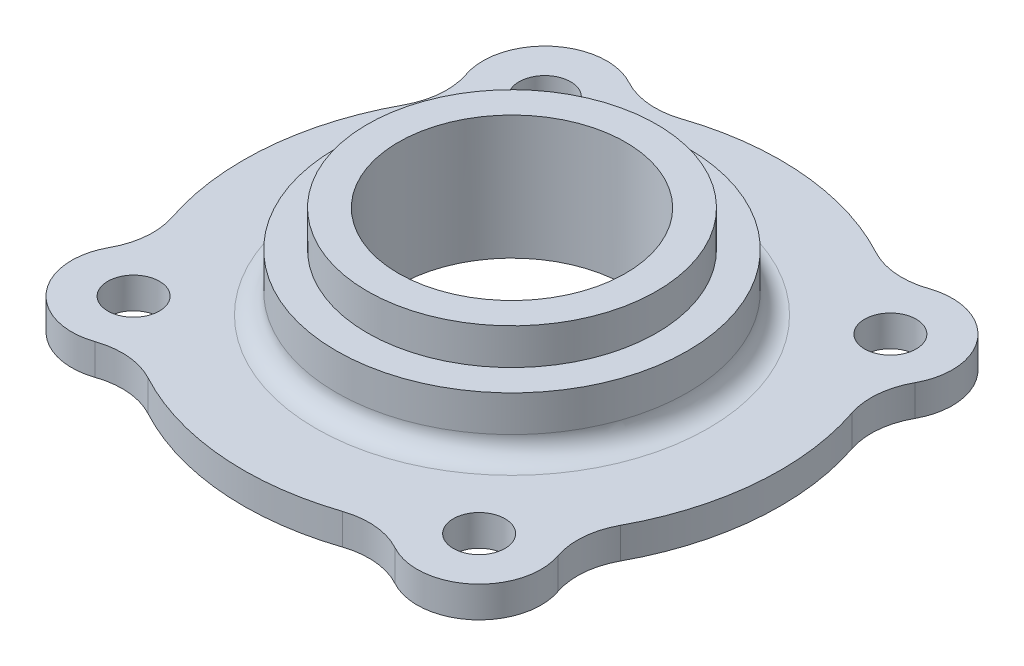
ISO-10303-21;
HEADER;
FILE_DESCRIPTION(('STEP AP214'),'2;1');
FILE_NAME('part.step','',(''),(''),'','','');
FILE_SCHEMA(('AUTOMOTIVE_DESIGN { 1 0 10303 214 1 1 1 1 }'));
ENDSEC;
DATA;
#1=APPLICATION_CONTEXT('core data for automotive mechanical design processes');
#2=APPLICATION_PROTOCOL_DEFINITION('international standard','automotive_design',2000,#1);
#3=PRODUCT_CONTEXT('',#1,'mechanical');
#4=PRODUCT('Part','Part','',(#3));
#5=PRODUCT_RELATED_PRODUCT_CATEGORY('part','',(#4));
#6=PRODUCT_DEFINITION_FORMATION('','',#4);
#7=PRODUCT_DEFINITION_CONTEXT('part definition',#1,'design');
#8=PRODUCT_DEFINITION('design','',#6,#7);
#9=PRODUCT_DEFINITION_SHAPE('','',#8);
#10=(LENGTH_UNIT() NAMED_UNIT(*) SI_UNIT(.MILLI.,.METRE.));
#11=(NAMED_UNIT(*) PLANE_ANGLE_UNIT() SI_UNIT($,.RADIAN.));
#12=(NAMED_UNIT(*) SI_UNIT($,.STERADIAN.) SOLID_ANGLE_UNIT());
#13=UNCERTAINTY_MEASURE_WITH_UNIT(LENGTH_MEASURE(1.E-05),#10,'distance_accuracy_value','');
#14=(GEOMETRIC_REPRESENTATION_CONTEXT(3) GLOBAL_UNCERTAINTY_ASSIGNED_CONTEXT((#13)) GLOBAL_UNIT_ASSIGNED_CONTEXT((#10,
#11,#12)) REPRESENTATION_CONTEXT('',''));
#15=CARTESIAN_POINT('',(0.,0.,0.));
#16=DIRECTION('',(0.,0.,1.));
#17=DIRECTION('',(1.,0.,0.));
#18=AXIS2_PLACEMENT_3D('',#15,#16,#17);
#19=CARTESIAN_POINT('',(0.,2.,0.));
#20=DIRECTION('',(0.,-1.,0.));
#21=DIRECTION('',(0.,0.,-1.));
#22=AXIS2_PLACEMENT_3D('',#19,#20,#21);
#23=TOROIDAL_SURFACE('',#22,19.,2.);
#24=CARTESIAN_POINT('',(0.,0.,0.));
#25=DIRECTION('',(0.,-1.,0.));
#26=DIRECTION('',(0.,0.,-1.));
#27=AXIS2_PLACEMENT_3D('',#24,#25,#26);
#28=CIRCLE('',#27,19.);
#29=CARTESIAN_POINT('',(0.,0.,-19.));
#30=VERTEX_POINT('',#29);
#31=EDGE_CURVE('E48',#30,#30,#28,.T.);
#32=ORIENTED_EDGE('',*,*,#31,.F.);
#33=EDGE_LOOP('',(#32));
#34=FACE_BOUND('',#33,.T.);
#35=CARTESIAN_POINT('',(0.,2.,0.));
#36=DIRECTION('',(0.,-1.,0.));
#37=DIRECTION('',(0.,0.,-1.));
#38=AXIS2_PLACEMENT_3D('',#35,#36,#37);
#39=CIRCLE('',#38,17.);
#40=CARTESIAN_POINT('',(0.,2.,-17.));
#41=VERTEX_POINT('',#40);
#42=EDGE_CURVE('E11',#41,#41,#39,.F.);
#43=ORIENTED_EDGE('',*,*,#42,.F.);
#44=EDGE_LOOP('',(#43));
#45=FACE_BOUND('',#44,.T.);
#46=ADVANCED_FACE('F39',(#34,#45),#23,.F.);
#47=CARTESIAN_POINT('',(-15.6989663666132,-3.,29.0265818693822));
#48=DIRECTION('',(0.,1.,0.));
#49=DIRECTION('',(0.,0.,1.));
#50=AXIS2_PLACEMENT_3D('',#47,#48,#49);
#51=CYLINDRICAL_SURFACE('',#50,7.);
#52=CARTESIAN_POINT('',(-15.6989663666132,0.,29.0265818693822));
#53=DIRECTION('',(0.,-1.,0.));
#54=DIRECTION('',(0.,0.,-1.));
#55=AXIS2_PLACEMENT_3D('',#52,#53,#54);
#56=CIRCLE('',#55,7.);
#57=CARTESIAN_POINT('',(-17.9641598120173,0.,22.4032217965115));
#58=VERTEX_POINT('',#57);
#59=CARTESIAN_POINT('',(-12.3688825918771,0.,22.8694281395133));
#60=VERTEX_POINT('',#59);
#61=EDGE_CURVE('E192',#58,#60,#56,.T.);
#62=ORIENTED_EDGE('',*,*,#61,.F.);
#63=DIRECTION('',(0.,1.,0.));
#64=VECTOR('',#63,1.);
#65=CARTESIAN_POINT('',(-17.9641598120173,-3.,22.4032217965115));
#66=LINE('',#65,#64);
#67=CARTESIAN_POINT('',(-17.9641598120173,-3.,22.4032217965115));
#68=VERTEX_POINT('',#67);
#69=EDGE_CURVE('E56',#68,#58,#66,.T.);
#70=ORIENTED_EDGE('',*,*,#69,.F.);
#71=CARTESIAN_POINT('',(-15.6989663666132,-3.,29.0265818693822));
#72=DIRECTION('',(0.,-1.,0.));
#73=DIRECTION('',(0.,0.,-1.));
#74=AXIS2_PLACEMENT_3D('',#71,#72,#73);
#75=CIRCLE('',#74,7.);
#76=CARTESIAN_POINT('',(-12.3688825918771,-3.,22.8694281395133));
#77=VERTEX_POINT('',#76);
#78=EDGE_CURVE('E254',#68,#77,#75,.T.);
#79=ORIENTED_EDGE('',*,*,#78,.T.);
#80=DIRECTION('',(0.,1.,0.));
#81=VECTOR('',#80,1.);
#82=CARTESIAN_POINT('',(-12.3688825918771,-3.,22.8694281395133));
#83=LINE('',#82,#81);
#84=EDGE_CURVE('E121',#77,#60,#83,.T.);
#85=ORIENTED_EDGE('',*,*,#84,.T.);
#86=EDGE_LOOP('',(#62,#70,#79,#85));
#87=FACE_BOUND('',#86,.T.);
#88=ADVANCED_FACE('F400',(#87),#51,.F.);
#89=CARTESIAN_POINT('',(-19.9057541937923,-3.,16.7260560197651));
#90=DIRECTION('',(0.,1.,0.));
#91=DIRECTION('',(0.,0.,1.));
#92=AXIS2_PLACEMENT_3D('',#89,#90,#91);
#93=CYLINDRICAL_SURFACE('',#92,6.);
#94=CARTESIAN_POINT('',(-19.9057541937923,0.,16.7260560197651));
#95=DIRECTION('',(0.,1.,0.));
#96=DIRECTION('',(0.,0.,1.));
#97=AXIS2_PLACEMENT_3D('',#94,#95,#96);
#98=CIRCLE('',#97,6.);
#99=CARTESIAN_POINT('',(-25.1634642036637,0.,13.8352973905991));
#100=VERTEX_POINT('',#99);
#101=EDGE_CURVE('E250',#100,#58,#98,.T.);
#102=ORIENTED_EDGE('',*,*,#101,.F.);
#103=DIRECTION('',(0.,1.,0.));
#104=VECTOR('',#103,1.);
#105=CARTESIAN_POINT('',(-25.1634642036637,-3.,13.8352973905991));
#106=LINE('',#105,#104);
#107=CARTESIAN_POINT('',(-25.1634642036637,-3.,13.8352973905991));
#108=VERTEX_POINT('',#107);
#109=EDGE_CURVE('E109',#108,#100,#106,.T.);
#110=ORIENTED_EDGE('',*,*,#109,.F.);
#111=CARTESIAN_POINT('',(-19.9057541937923,-3.,16.7260560197651));
#112=DIRECTION('',(0.,1.,0.));
#113=DIRECTION('',(0.,0.,1.));
#114=AXIS2_PLACEMENT_3D('',#111,#112,#113);
#115=CIRCLE('',#114,6.);
#116=EDGE_CURVE('E178',#108,#68,#115,.T.);
#117=ORIENTED_EDGE('',*,*,#116,.T.);
#118=ORIENTED_EDGE('',*,*,#69,.T.);
#119=EDGE_LOOP('',(#102,#110,#117,#118));
#120=FACE_BOUND('',#119,.T.);
#121=ADVANCED_FACE('F401',(#120),#93,.T.);
#122=CARTESIAN_POINT('',(-31.2974592151804,-3.,10.4627456565722));
#123=DIRECTION('',(0.,1.,0.));
#124=DIRECTION('',(0.,0.,1.));
#125=AXIS2_PLACEMENT_3D('',#122,#123,#124);
#126=CYLINDRICAL_SURFACE('',#125,7.);
#127=CARTESIAN_POINT('',(-31.2974592151804,0.,10.4627456565722));
#128=DIRECTION('',(0.,-1.,0.));
#129=DIRECTION('',(0.,0.,-1.));
#130=AXIS2_PLACEMENT_3D('',#127,#128,#129);
#131=CIRCLE('',#130,7.);
#132=CARTESIAN_POINT('',(-24.6586042301421,0.,8.24337536578413));
#133=VERTEX_POINT('',#132);
#134=EDGE_CURVE('E164',#133,#100,#131,.T.);
#135=ORIENTED_EDGE('',*,*,#134,.F.);
#136=DIRECTION('',(0.,1.,0.));
#137=VECTOR('',#136,1.);
#138=CARTESIAN_POINT('',(-24.6586042301421,-3.,8.24337536578413));
#139=LINE('',#138,#137);
#140=CARTESIAN_POINT('',(-24.6586042301421,-3.,8.24337536578413));
#141=VERTEX_POINT('',#140);
#142=EDGE_CURVE('E159',#141,#133,#139,.T.);
#143=ORIENTED_EDGE('',*,*,#142,.F.);
#144=CARTESIAN_POINT('',(-31.2974592151804,-3.,10.4627456565722));
#145=DIRECTION('',(0.,-1.,0.));
#146=DIRECTION('',(0.,0.,-1.));
#147=AXIS2_PLACEMENT_3D('',#144,#145,#146);
#148=CIRCLE('',#147,7.);
#149=EDGE_CURVE('E162',#141,#108,#148,.T.);
#150=ORIENTED_EDGE('',*,*,#149,.T.);
#151=ORIENTED_EDGE('',*,*,#109,.T.);
#152=EDGE_LOOP('',(#135,#143,#150,#151));
#153=FACE_BOUND('',#152,.T.);
#154=ADVANCED_FACE('F161',(#153),#126,.F.);
#155=CARTESIAN_POINT('',(0.,-3.,0.));
#156=DIRECTION('',(0.,1.,0.));
#157=DIRECTION('',(0.,0.,1.));
#158=AXIS2_PLACEMENT_3D('',#155,#156,#157);
#159=CYLINDRICAL_SURFACE('',#158,26.);
#160=CARTESIAN_POINT('',(0.,0.,0.));
#161=DIRECTION('',(0.,1.,0.));
#162=DIRECTION('',(0.,0.,1.));
#163=AXIS2_PLACEMENT_3D('',#160,#161,#162);
#164=CIRCLE('',#163,26.);
#165=CARTESIAN_POINT('',(-22.8694281395132,0.,-12.3688825918771));
#166=VERTEX_POINT('',#165);
#167=EDGE_CURVE('E245',#166,#133,#164,.T.);
#168=ORIENTED_EDGE('',*,*,#167,.F.);
#169=DIRECTION('',(0.,1.,0.));
#170=VECTOR('',#169,1.);
#171=CARTESIAN_POINT('',(-22.8694281395132,-3.,-12.3688825918771));
#172=LINE('',#171,#170);
#173=CARTESIAN_POINT('',(-22.8694281395132,-3.,-12.3688825918771));
#174=VERTEX_POINT('',#173);
#175=EDGE_CURVE('E170',#174,#166,#172,.T.);
#176=ORIENTED_EDGE('',*,*,#175,.F.);
#177=CARTESIAN_POINT('',(0.,-3.,0.));
#178=DIRECTION('',(0.,1.,0.));
#179=DIRECTION('',(0.,0.,1.));
#180=AXIS2_PLACEMENT_3D('',#177,#178,#179);
#181=CIRCLE('',#180,26.);
#182=EDGE_CURVE('E176',#174,#141,#181,.T.);
#183=ORIENTED_EDGE('',*,*,#182,.T.);
#184=ORIENTED_EDGE('',*,*,#142,.T.);
#185=EDGE_LOOP('',(#168,#176,#183,#184));
#186=FACE_BOUND('',#185,.T.);
#187=ADVANCED_FACE('F181',(#186),#159,.T.);
#188=CARTESIAN_POINT('',(-29.0265818693822,-3.,-15.6989663666133));
#189=DIRECTION('',(0.,1.,0.));
#190=DIRECTION('',(0.,0.,1.));
#191=AXIS2_PLACEMENT_3D('',#188,#189,#190);
#192=CYLINDRICAL_SURFACE('',#191,7.);
#193=CARTESIAN_POINT('',(-29.0265818693822,0.,-15.6989663666133));
#194=DIRECTION('',(0.,-1.,0.));
#195=DIRECTION('',(0.,0.,-1.));
#196=AXIS2_PLACEMENT_3D('',#193,#194,#195);
#197=CIRCLE('',#196,7.);
#198=CARTESIAN_POINT('',(-22.4032217965114,0.,-17.9641598120174));
#199=VERTEX_POINT('',#198);
#200=EDGE_CURVE('E241',#199,#166,#197,.T.);
#201=ORIENTED_EDGE('',*,*,#200,.F.);
#202=DIRECTION('',(0.,1.,0.));
#203=VECTOR('',#202,1.);
#204=CARTESIAN_POINT('',(-22.4032217965114,-3.,-17.9641598120174));
#205=LINE('',#204,#203);
#206=CARTESIAN_POINT('',(-22.4032217965114,-3.,-17.9641598120174));
#207=VERTEX_POINT('',#206);
#208=EDGE_CURVE('E262',#207,#199,#205,.T.);
#209=ORIENTED_EDGE('',*,*,#208,.F.);
#210=CARTESIAN_POINT('',(-29.0265818693822,-3.,-15.6989663666133));
#211=DIRECTION('',(0.,-1.,0.));
#212=DIRECTION('',(0.,0.,-1.));
#213=AXIS2_PLACEMENT_3D('',#210,#211,#212);
#214=CIRCLE('',#213,7.);
#215=EDGE_CURVE('E183',#207,#174,#214,.T.);
#216=ORIENTED_EDGE('',*,*,#215,.T.);
#217=ORIENTED_EDGE('',*,*,#175,.T.);
#218=EDGE_LOOP('',(#201,#209,#216,#217));
#219=FACE_BOUND('',#218,.T.);
#220=ADVANCED_FACE('F362',(#219),#192,.F.);
#221=CARTESIAN_POINT('',(-16.7260560197651,-3.,-19.9057541937923));
#222=DIRECTION('',(0.,1.,0.));
#223=DIRECTION('',(0.,0.,1.));
#224=AXIS2_PLACEMENT_3D('',#221,#222,#223);
#225=CYLINDRICAL_SURFACE('',#224,6.);
#226=CARTESIAN_POINT('',(-16.7260560197651,0.,-19.9057541937923));
#227=DIRECTION('',(0.,1.,0.));
#228=DIRECTION('',(0.,0.,1.));
#229=AXIS2_PLACEMENT_3D('',#226,#227,#228);
#230=CIRCLE('',#229,6.);
#231=CARTESIAN_POINT('',(-13.8352973905991,0.,-25.1634642036638));
#232=VERTEX_POINT('',#231);
#233=EDGE_CURVE('E237',#232,#199,#230,.T.);
#234=ORIENTED_EDGE('',*,*,#233,.F.);
#235=DIRECTION('',(0.,1.,0.));
#236=VECTOR('',#235,1.);
#237=CARTESIAN_POINT('',(-13.8352973905991,-3.,-25.1634642036638));
#238=LINE('',#237,#236);
#239=CARTESIAN_POINT('',(-13.8352973905991,-3.,-25.1634642036638));
#240=VERTEX_POINT('',#239);
#241=EDGE_CURVE('E265',#240,#232,#238,.T.);
#242=ORIENTED_EDGE('',*,*,#241,.F.);
#243=CARTESIAN_POINT('',(-16.7260560197651,-3.,-19.9057541937923));
#244=DIRECTION('',(0.,1.,0.));
#245=DIRECTION('',(0.,0.,1.));
#246=AXIS2_PLACEMENT_3D('',#243,#244,#245);
#247=CIRCLE('',#246,6.);
#248=EDGE_CURVE('E186',#240,#207,#247,.T.);
#249=ORIENTED_EDGE('',*,*,#248,.T.);
#250=ORIENTED_EDGE('',*,*,#208,.T.);
#251=EDGE_LOOP('',(#234,#242,#249,#250));
#252=FACE_BOUND('',#251,.T.);
#253=ADVANCED_FACE('F356',(#252),#225,.T.);
#254=CARTESIAN_POINT('',(-10.462745656572,-3.,-31.2974592151804));
#255=DIRECTION('',(0.,1.,0.));
#256=DIRECTION('',(0.,0.,1.));
#257=AXIS2_PLACEMENT_3D('',#254,#255,#256);
#258=CYLINDRICAL_SURFACE('',#257,7.);
#259=CARTESIAN_POINT('',(-10.462745656572,0.,-31.2974592151804));
#260=DIRECTION('',(0.,1.,0.));
#261=DIRECTION('',(0.,0.,1.));
#262=AXIS2_PLACEMENT_3D('',#259,#260,#261);
#263=CIRCLE('',#262,7.);
#264=CARTESIAN_POINT('',(-8.24337536578403,0.,-24.6586042301422));
#265=VERTEX_POINT('',#264);
#266=EDGE_CURVE('E233',#232,#265,#263,.T.);
#267=ORIENTED_EDGE('',*,*,#266,.T.);
#268=DIRECTION('',(0.,1.,0.));
#269=VECTOR('',#268,1.);
#270=CARTESIAN_POINT('',(-8.24337536578403,-3.,-24.6586042301422));
#271=LINE('',#270,#269);
#272=CARTESIAN_POINT('',(-8.24337536578403,-3.,-24.6586042301422));
#273=VERTEX_POINT('',#272);
#274=EDGE_CURVE('E268',#273,#265,#271,.T.);
#275=ORIENTED_EDGE('',*,*,#274,.F.);
#276=CARTESIAN_POINT('',(-10.462745656572,-3.,-31.2974592151804));
#277=DIRECTION('',(0.,1.,0.));
#278=DIRECTION('',(0.,0.,1.));
#279=AXIS2_PLACEMENT_3D('',#276,#277,#278);
#280=CIRCLE('',#279,7.);
#281=EDGE_CURVE('E349',#240,#273,#280,.T.);
#282=ORIENTED_EDGE('',*,*,#281,.F.);
#283=ORIENTED_EDGE('',*,*,#241,.T.);
#284=EDGE_LOOP('',(#267,#275,#282,#283));
#285=FACE_BOUND('',#284,.T.);
#286=ADVANCED_FACE('F368',(#285),#258,.F.);
#287=CARTESIAN_POINT('',(0.,-3.,0.));
#288=DIRECTION('',(0.,1.,0.));
#289=DIRECTION('',(0.,0.,1.));
#290=AXIS2_PLACEMENT_3D('',#287,#288,#289);
#291=CYLINDRICAL_SURFACE('',#290,26.);
#292=CARTESIAN_POINT('',(0.,0.,0.));
#293=DIRECTION('',(0.,1.,0.));
#294=DIRECTION('',(0.,0.,1.));
#295=AXIS2_PLACEMENT_3D('',#292,#293,#294);
#296=CIRCLE('',#295,26.);
#297=CARTESIAN_POINT('',(12.3688825918772,0.,-22.8694281395132));
#298=VERTEX_POINT('',#297);
#299=EDGE_CURVE('E229',#298,#265,#296,.T.);
#300=ORIENTED_EDGE('',*,*,#299,.F.);
#301=DIRECTION('',(0.,1.,0.));
#302=VECTOR('',#301,1.);
#303=CARTESIAN_POINT('',(12.3688825918772,-3.,-22.8694281395132));
#304=LINE('',#303,#302);
#305=CARTESIAN_POINT('',(12.3688825918772,-3.,-22.8694281395132));
#306=VERTEX_POINT('',#305);
#307=EDGE_CURVE('E271',#306,#298,#304,.T.);
#308=ORIENTED_EDGE('',*,*,#307,.F.);
#309=CARTESIAN_POINT('',(0.,-3.,0.));
#310=DIRECTION('',(0.,1.,0.));
#311=DIRECTION('',(0.,0.,1.));
#312=AXIS2_PLACEMENT_3D('',#309,#310,#311);
#313=CIRCLE('',#312,26.);
#314=EDGE_CURVE('E345',#306,#273,#313,.T.);
#315=ORIENTED_EDGE('',*,*,#314,.T.);
#316=ORIENTED_EDGE('',*,*,#274,.T.);
#317=EDGE_LOOP('',(#300,#308,#315,#316));
#318=FACE_BOUND('',#317,.T.);
#319=ADVANCED_FACE('F370',(#318),#291,.T.);
#320=CARTESIAN_POINT('',(15.6989663666134,-3.,-29.0265818693821));
#321=DIRECTION('',(0.,1.,0.));
#322=DIRECTION('',(0.,0.,1.));
#323=AXIS2_PLACEMENT_3D('',#320,#321,#322);
#324=CYLINDRICAL_SURFACE('',#323,7.);
#325=CARTESIAN_POINT('',(15.6989663666134,0.,-29.0265818693821));
#326=DIRECTION('',(0.,-1.,0.));
#327=DIRECTION('',(0.,0.,-1.));
#328=AXIS2_PLACEMENT_3D('',#325,#326,#327);
#329=CIRCLE('',#328,7.);
#330=CARTESIAN_POINT('',(17.9641598120175,0.,-22.4032217965114));
#331=VERTEX_POINT('',#330);
#332=EDGE_CURVE('E225',#331,#298,#329,.T.);
#333=ORIENTED_EDGE('',*,*,#332,.F.);
#334=DIRECTION('',(0.,1.,0.));
#335=VECTOR('',#334,1.);
#336=CARTESIAN_POINT('',(17.9641598120175,-3.,-22.4032217965114));
#337=LINE('',#336,#335);
#338=CARTESIAN_POINT('',(17.9641598120175,-3.,-22.4032217965114));
#339=VERTEX_POINT('',#338);
#340=EDGE_CURVE('E274',#339,#331,#337,.T.);
#341=ORIENTED_EDGE('',*,*,#340,.F.);
#342=CARTESIAN_POINT('',(15.6989663666134,-3.,-29.0265818693821));
#343=DIRECTION('',(0.,-1.,0.));
#344=DIRECTION('',(0.,0.,-1.));
#345=AXIS2_PLACEMENT_3D('',#342,#343,#344);
#346=CIRCLE('',#345,7.);
#347=EDGE_CURVE('E341',#339,#306,#346,.T.);
#348=ORIENTED_EDGE('',*,*,#347,.T.);
#349=ORIENTED_EDGE('',*,*,#307,.T.);
#350=EDGE_LOOP('',(#333,#341,#348,#349));
#351=FACE_BOUND('',#350,.T.);
#352=ADVANCED_FACE('F375',(#351),#324,.F.);
#353=CARTESIAN_POINT('',(19.9057541937924,-3.,-16.726056019765));
#354=DIRECTION('',(0.,1.,0.));
#355=DIRECTION('',(0.,0.,1.));
#356=AXIS2_PLACEMENT_3D('',#353,#354,#355);
#357=CYLINDRICAL_SURFACE('',#356,6.00000000000001);
#358=CARTESIAN_POINT('',(19.9057541937924,0.,-16.726056019765));
#359=DIRECTION('',(0.,1.,0.));
#360=DIRECTION('',(0.,0.,1.));
#361=AXIS2_PLACEMENT_3D('',#358,#359,#360);
#362=CIRCLE('',#361,6.00000000000001);
#363=CARTESIAN_POINT('',(25.1634642036638,0.,-13.835297390599));
#364=VERTEX_POINT('',#363);
#365=EDGE_CURVE('E221',#364,#331,#362,.T.);
#366=ORIENTED_EDGE('',*,*,#365,.F.);
#367=DIRECTION('',(0.,1.,0.));
#368=VECTOR('',#367,1.);
#369=CARTESIAN_POINT('',(25.1634642036638,-3.,-13.835297390599));
#370=LINE('',#369,#368);
#371=CARTESIAN_POINT('',(25.1634642036638,-3.,-13.835297390599));
#372=VERTEX_POINT('',#371);
#373=EDGE_CURVE('E277',#372,#364,#370,.T.);
#374=ORIENTED_EDGE('',*,*,#373,.F.);
#375=CARTESIAN_POINT('',(19.9057541937924,-3.,-16.726056019765));
#376=DIRECTION('',(0.,1.,0.));
#377=DIRECTION('',(0.,0.,1.));
#378=AXIS2_PLACEMENT_3D('',#375,#376,#377);
#379=CIRCLE('',#378,6.00000000000001);
#380=EDGE_CURVE('E337',#372,#339,#379,.T.);
#381=ORIENTED_EDGE('',*,*,#380,.T.);
#382=ORIENTED_EDGE('',*,*,#340,.T.);
#383=EDGE_LOOP('',(#366,#374,#381,#382));
#384=FACE_BOUND('',#383,.T.);
#385=ADVANCED_FACE('F378',(#384),#357,.T.);
#386=CARTESIAN_POINT('',(31.2974592151805,-3.,-10.4627456565719));
#387=DIRECTION('',(0.,1.,0.));
#388=DIRECTION('',(0.,0.,1.));
#389=AXIS2_PLACEMENT_3D('',#386,#387,#388);
#390=CYLINDRICAL_SURFACE('',#389,7.);
#391=CARTESIAN_POINT('',(31.2974592151805,0.,-10.4627456565719));
#392=DIRECTION('',(0.,-1.,0.));
#393=DIRECTION('',(0.,0.,-1.));
#394=AXIS2_PLACEMENT_3D('',#391,#392,#393);
#395=CIRCLE('',#394,7.);
#396=CARTESIAN_POINT('',(24.6586042301422,0.,-8.24337536578395));
#397=VERTEX_POINT('',#396);
#398=EDGE_CURVE('E217',#397,#364,#395,.T.);
#399=ORIENTED_EDGE('',*,*,#398,.F.);
#400=DIRECTION('',(0.,1.,0.));
#401=VECTOR('',#400,1.);
#402=CARTESIAN_POINT('',(24.6586042301422,-3.,-8.24337536578395));
#403=LINE('',#402,#401);
#404=CARTESIAN_POINT('',(24.6586042301422,-3.,-8.24337536578395));
#405=VERTEX_POINT('',#404);
#406=EDGE_CURVE('E280',#405,#397,#403,.T.);
#407=ORIENTED_EDGE('',*,*,#406,.F.);
#408=CARTESIAN_POINT('',(31.2974592151805,-3.,-10.4627456565719));
#409=DIRECTION('',(0.,-1.,0.));
#410=DIRECTION('',(0.,0.,-1.));
#411=AXIS2_PLACEMENT_3D('',#408,#409,#410);
#412=CIRCLE('',#411,7.);
#413=EDGE_CURVE('E333',#405,#372,#412,.T.);
#414=ORIENTED_EDGE('',*,*,#413,.T.);
#415=ORIENTED_EDGE('',*,*,#373,.T.);
#416=EDGE_LOOP('',(#399,#407,#414,#415));
#417=FACE_BOUND('',#416,.T.);
#418=ADVANCED_FACE('F383',(#417),#390,.F.);
#419=CARTESIAN_POINT('',(0.,-3.,0.));
#420=DIRECTION('',(0.,1.,0.));
#421=DIRECTION('',(0.,0.,1.));
#422=AXIS2_PLACEMENT_3D('',#419,#420,#421);
#423=CYLINDRICAL_SURFACE('',#422,26.);
#424=CARTESIAN_POINT('',(0.,0.,0.));
#425=DIRECTION('',(0.,1.,0.));
#426=DIRECTION('',(0.,0.,1.));
#427=AXIS2_PLACEMENT_3D('',#424,#425,#426);
#428=CIRCLE('',#427,26.);
#429=CARTESIAN_POINT('',(22.8694281395131,0.,12.3688825918773));
#430=VERTEX_POINT('',#429);
#431=EDGE_CURVE('E213',#430,#397,#428,.T.);
#432=ORIENTED_EDGE('',*,*,#431,.F.);
#433=DIRECTION('',(0.,1.,0.));
#434=VECTOR('',#433,1.);
#435=CARTESIAN_POINT('',(22.8694281395131,-3.,12.3688825918773));
#436=LINE('',#435,#434);
#437=CARTESIAN_POINT('',(22.8694281395131,-3.,12.3688825918773));
#438=VERTEX_POINT('',#437);
#439=EDGE_CURVE('E283',#438,#430,#436,.T.);
#440=ORIENTED_EDGE('',*,*,#439,.F.);
#441=CARTESIAN_POINT('',(0.,-3.,0.));
#442=DIRECTION('',(0.,1.,0.));
#443=DIRECTION('',(0.,0.,1.));
#444=AXIS2_PLACEMENT_3D('',#441,#442,#443);
#445=CIRCLE('',#444,26.);
#446=EDGE_CURVE('E329',#438,#405,#445,.T.);
#447=ORIENTED_EDGE('',*,*,#446,.T.);
#448=ORIENTED_EDGE('',*,*,#406,.T.);
#449=EDGE_LOOP('',(#432,#440,#447,#448));
#450=FACE_BOUND('',#449,.T.);
#451=ADVANCED_FACE('F386',(#450),#423,.T.);
#452=CARTESIAN_POINT('',(29.0265818693821,-3.,15.6989663666135));
#453=DIRECTION('',(0.,1.,0.));
#454=DIRECTION('',(0.,0.,1.));
#455=AXIS2_PLACEMENT_3D('',#452,#453,#454);
#456=CYLINDRICAL_SURFACE('',#455,7.);
#457=CARTESIAN_POINT('',(29.0265818693821,0.,15.6989663666135));
#458=DIRECTION('',(0.,-1.,0.));
#459=DIRECTION('',(0.,0.,-1.));
#460=AXIS2_PLACEMENT_3D('',#457,#458,#459);
#461=CIRCLE('',#460,7.);
#462=CARTESIAN_POINT('',(22.4032217965113,0.,17.9641598120175));
#463=VERTEX_POINT('',#462);
#464=EDGE_CURVE('E209',#463,#430,#461,.T.);
#465=ORIENTED_EDGE('',*,*,#464,.F.);
#466=DIRECTION('',(0.,1.,0.));
#467=VECTOR('',#466,1.);
#468=CARTESIAN_POINT('',(22.4032217965113,-3.,17.9641598120175));
#469=LINE('',#468,#467);
#470=CARTESIAN_POINT('',(22.4032217965113,-3.,17.9641598120175));
#471=VERTEX_POINT('',#470);
#472=EDGE_CURVE('E286',#471,#463,#469,.T.);
#473=ORIENTED_EDGE('',*,*,#472,.F.);
#474=CARTESIAN_POINT('',(29.0265818693821,-3.,15.6989663666135));
#475=DIRECTION('',(0.,-1.,0.));
#476=DIRECTION('',(0.,0.,-1.));
#477=AXIS2_PLACEMENT_3D('',#474,#475,#476);
#478=CIRCLE('',#477,7.);
#479=EDGE_CURVE('E325',#471,#438,#478,.T.);
#480=ORIENTED_EDGE('',*,*,#479,.T.);
#481=ORIENTED_EDGE('',*,*,#439,.T.);
#482=EDGE_LOOP('',(#465,#473,#480,#481));
#483=FACE_BOUND('',#482,.T.);
#484=ADVANCED_FACE('F391',(#483),#456,.F.);
#485=CARTESIAN_POINT('',(16.7260560197649,-3.,19.9057541937924));
#486=DIRECTION('',(0.,1.,0.));
#487=DIRECTION('',(0.,0.,1.));
#488=AXIS2_PLACEMENT_3D('',#485,#486,#487);
#489=CYLINDRICAL_SURFACE('',#488,6.);
#490=CARTESIAN_POINT('',(16.7260560197649,0.,19.9057541937924));
#491=DIRECTION('',(0.,1.,0.));
#492=DIRECTION('',(0.,0.,1.));
#493=AXIS2_PLACEMENT_3D('',#490,#491,#492);
#494=CIRCLE('',#493,6.);
#495=CARTESIAN_POINT('',(13.8352973905989,0.,25.1634642036639));
#496=VERTEX_POINT('',#495);
#497=EDGE_CURVE('E205',#496,#463,#494,.T.);
#498=ORIENTED_EDGE('',*,*,#497,.F.);
#499=DIRECTION('',(0.,1.,0.));
#500=VECTOR('',#499,1.);
#501=CARTESIAN_POINT('',(13.8352973905989,-3.,25.1634642036639));
#502=LINE('',#501,#500);
#503=CARTESIAN_POINT('',(13.8352973905989,-3.,25.1634642036639));
#504=VERTEX_POINT('',#503);
#505=EDGE_CURVE('E289',#504,#496,#502,.T.);
#506=ORIENTED_EDGE('',*,*,#505,.F.);
#507=CARTESIAN_POINT('',(16.7260560197649,-3.,19.9057541937924));
#508=DIRECTION('',(0.,1.,0.));
#509=DIRECTION('',(0.,0.,1.));
#510=AXIS2_PLACEMENT_3D('',#507,#508,#509);
#511=CIRCLE('',#510,6.);
#512=EDGE_CURVE('E321',#504,#471,#511,.T.);
#513=ORIENTED_EDGE('',*,*,#512,.T.);
#514=ORIENTED_EDGE('',*,*,#472,.T.);
#515=EDGE_LOOP('',(#498,#506,#513,#514));
#516=FACE_BOUND('',#515,.T.);
#517=ADVANCED_FACE('F394',(#516),#489,.T.);
#518=CARTESIAN_POINT('',(10.4627456565718,-3.,31.2974592151805));
#519=DIRECTION('',(0.,1.,0.));
#520=DIRECTION('',(0.,0.,1.));
#521=AXIS2_PLACEMENT_3D('',#518,#519,#520);
#522=CYLINDRICAL_SURFACE('',#521,7.);
#523=CARTESIAN_POINT('',(10.4627456565718,0.,31.2974592151805));
#524=DIRECTION('',(0.,-1.,0.));
#525=DIRECTION('',(0.,0.,-1.));
#526=AXIS2_PLACEMENT_3D('',#523,#524,#525);
#527=CIRCLE('',#526,7.);
#528=CARTESIAN_POINT('',(8.24337536578387,0.,24.6586042301422));
#529=VERTEX_POINT('',#528);
#530=EDGE_CURVE('E201',#529,#496,#527,.T.);
#531=ORIENTED_EDGE('',*,*,#530,.F.);
#532=DIRECTION('',(0.,1.,0.));
#533=VECTOR('',#532,1.);
#534=CARTESIAN_POINT('',(8.24337536578387,-3.,24.6586042301422));
#535=LINE('',#534,#533);
#536=CARTESIAN_POINT('',(8.24337536578387,-3.,24.6586042301422));
#537=VERTEX_POINT('',#536);
#538=EDGE_CURVE('E292',#537,#529,#535,.T.);
#539=ORIENTED_EDGE('',*,*,#538,.F.);
#540=CARTESIAN_POINT('',(10.4627456565718,-3.,31.2974592151805));
#541=DIRECTION('',(0.,-1.,0.));
#542=DIRECTION('',(0.,0.,-1.));
#543=AXIS2_PLACEMENT_3D('',#540,#541,#542);
#544=CIRCLE('',#543,7.);
#545=EDGE_CURVE('E317',#537,#504,#544,.T.);
#546=ORIENTED_EDGE('',*,*,#545,.T.);
#547=ORIENTED_EDGE('',*,*,#505,.T.);
#548=EDGE_LOOP('',(#531,#539,#546,#547));
#549=FACE_BOUND('',#548,.T.);
#550=ADVANCED_FACE('F398',(#549),#522,.F.);
#551=CARTESIAN_POINT('',(0.,-3.,0.));
#552=DIRECTION('',(0.,1.,0.));
#553=DIRECTION('',(0.,0.,1.));
#554=AXIS2_PLACEMENT_3D('',#551,#552,#553);
#555=CYLINDRICAL_SURFACE('',#554,26.);
#556=CARTESIAN_POINT('',(0.,0.,0.));
#557=DIRECTION('',(0.,1.,0.));
#558=DIRECTION('',(0.,0.,1.));
#559=AXIS2_PLACEMENT_3D('',#556,#557,#558);
#560=CIRCLE('',#559,26.);
#561=EDGE_CURVE('E196',#60,#529,#560,.T.);
#562=ORIENTED_EDGE('',*,*,#561,.F.);
#563=ORIENTED_EDGE('',*,*,#84,.F.);
#564=CARTESIAN_POINT('',(0.,-3.,0.));
#565=DIRECTION('',(0.,1.,0.));
#566=DIRECTION('',(0.,0.,1.));
#567=AXIS2_PLACEMENT_3D('',#564,#565,#566);
#568=CIRCLE('',#567,26.);
#569=EDGE_CURVE('E314',#77,#537,#568,.T.);
#570=ORIENTED_EDGE('',*,*,#569,.T.);
#571=ORIENTED_EDGE('',*,*,#538,.T.);
#572=EDGE_LOOP('',(#562,#563,#570,#571));
#573=FACE_BOUND('',#572,.T.);
#574=ADVANCED_FACE('F399',(#573),#555,.T.);
#575=CARTESIAN_POINT('',(-7.84948318330659,-3.,14.5132909346911));
#576=DIRECTION('',(0.,-1.,0.));
#577=DIRECTION('',(0.,0.,-1.));
#578=AXIS2_PLACEMENT_3D('',#575,#576,#577);
#579=PLANE('',#578);
#580=CARTESIAN_POINT('',(19.9057541937924,-3.,-16.726056019765));
#581=DIRECTION('',(0.,-1.,0.));
#582=DIRECTION('',(0.,0.,-1.));
#583=AXIS2_PLACEMENT_3D('',#580,#581,#582);
#584=CIRCLE('',#583,2.5);
#585=CARTESIAN_POINT('',(19.9057541937924,-3.,-19.226056019765));
#586=VERTEX_POINT('',#585);
#587=EDGE_CURVE('E511',#586,#586,#584,.T.);
#588=ORIENTED_EDGE('',*,*,#587,.F.);
#589=EDGE_LOOP('',(#588));
#590=FACE_BOUND('',#589,.T.);
#591=CARTESIAN_POINT('',(-19.9057541937923,-3.,16.7260560197651));
#592=DIRECTION('',(0.,-1.,0.));
#593=DIRECTION('',(0.,0.,-1.));
#594=AXIS2_PLACEMENT_3D('',#591,#592,#593);
#595=CIRCLE('',#594,2.5);
#596=CARTESIAN_POINT('',(-19.9057541937923,-3.,14.2260560197651));
#597=VERTEX_POINT('',#596);
#598=EDGE_CURVE('E519',#597,#597,#595,.T.);
#599=ORIENTED_EDGE('',*,*,#598,.F.);
#600=EDGE_LOOP('',(#599));
#601=FACE_BOUND('',#600,.T.);
#602=CARTESIAN_POINT('',(16.7260560197649,-3.,19.9057541937924));
#603=DIRECTION('',(0.,-1.,0.));
#604=DIRECTION('',(0.,0.,-1.));
#605=AXIS2_PLACEMENT_3D('',#602,#603,#604);
#606=CIRCLE('',#605,2.5);
#607=CARTESIAN_POINT('',(16.7260560197649,-3.,17.4057541937924));
#608=VERTEX_POINT('',#607);
#609=EDGE_CURVE('E460',#608,#608,#606,.T.);
#610=ORIENTED_EDGE('',*,*,#609,.F.);
#611=EDGE_LOOP('',(#610));
#612=FACE_BOUND('',#611,.T.);
#613=CARTESIAN_POINT('',(-16.7260560197651,-3.,-19.9057541937923));
#614=DIRECTION('',(0.,-1.,0.));
#615=DIRECTION('',(0.,0.,-1.));
#616=AXIS2_PLACEMENT_3D('',#613,#614,#615);
#617=CIRCLE('',#616,2.5);
#618=CARTESIAN_POINT('',(-16.7260560197651,-3.,-22.4057541937923));
#619=VERTEX_POINT('',#618);
#620=EDGE_CURVE('E459',#619,#619,#617,.T.);
#621=ORIENTED_EDGE('',*,*,#620,.F.);
#622=EDGE_LOOP('',(#621));
#623=FACE_BOUND('',#622,.T.);
#624=CARTESIAN_POINT('',(0.,-3.,0.));
#625=DIRECTION('',(0.,-1.,0.));
#626=DIRECTION('',(0.,0.,-1.));
#627=AXIS2_PLACEMENT_3D('',#624,#625,#626);
#628=CIRCLE('',#627,11.);
#629=CARTESIAN_POINT('',(0.,-3.,-11.));
#630=VERTEX_POINT('',#629);
#631=EDGE_CURVE('E473',#630,#630,#628,.T.);
#632=ORIENTED_EDGE('',*,*,#631,.F.);
#633=EDGE_LOOP('',(#632));
#634=FACE_BOUND('',#633,.T.);
#635=ORIENTED_EDGE('',*,*,#78,.F.);
#636=ORIENTED_EDGE('',*,*,#116,.F.);
#637=ORIENTED_EDGE('',*,*,#149,.F.);
#638=ORIENTED_EDGE('',*,*,#182,.F.);
#639=ORIENTED_EDGE('',*,*,#215,.F.);
#640=ORIENTED_EDGE('',*,*,#248,.F.);
#641=ORIENTED_EDGE('',*,*,#281,.T.);
#642=ORIENTED_EDGE('',*,*,#314,.F.);
#643=ORIENTED_EDGE('',*,*,#347,.F.);
#644=ORIENTED_EDGE('',*,*,#380,.F.);
#645=ORIENTED_EDGE('',*,*,#413,.F.);
#646=ORIENTED_EDGE('',*,*,#446,.F.);
#647=ORIENTED_EDGE('',*,*,#479,.F.);
#648=ORIENTED_EDGE('',*,*,#512,.F.);
#649=ORIENTED_EDGE('',*,*,#545,.F.);
#650=ORIENTED_EDGE('',*,*,#569,.F.);
#651=EDGE_LOOP('',(#635,#636,#637,#638,#639,#640,#641,#642,#643,#644,#645,#646,#647,#648,#649,#650));
#652=FACE_BOUND('',#651,.T.);
#653=ADVANCED_FACE('F174',(#590,#601,#612,#623,#634,#652),#579,.T.);
#654=CARTESIAN_POINT('',(-7.84948318330659,0.,14.5132909346911));
#655=DIRECTION('',(0.,-1.,0.));
#656=DIRECTION('',(0.,0.,-1.));
#657=AXIS2_PLACEMENT_3D('',#654,#655,#656);
#658=PLANE('',#657);
#659=ORIENTED_EDGE('',*,*,#31,.T.);
#660=EDGE_LOOP('',(#659));
#661=FACE_BOUND('',#660,.T.);
#662=CARTESIAN_POINT('',(19.9057541937924,0.,-16.726056019765));
#663=DIRECTION('',(0.,1.,0.));
#664=DIRECTION('',(0.,0.,1.));
#665=AXIS2_PLACEMENT_3D('',#662,#663,#664);
#666=CIRCLE('',#665,2.5);
#667=CARTESIAN_POINT('',(19.9057541937924,0.,-14.226056019765));
#668=VERTEX_POINT('',#667);
#669=EDGE_CURVE('E445',#668,#668,#666,.T.);
#670=ORIENTED_EDGE('',*,*,#669,.F.);
#671=EDGE_LOOP('',(#670));
#672=FACE_BOUND('',#671,.T.);
#673=CARTESIAN_POINT('',(-19.9057541937923,0.,16.7260560197651));
#674=DIRECTION('',(0.,1.,0.));
#675=DIRECTION('',(0.,0.,1.));
#676=AXIS2_PLACEMENT_3D('',#673,#674,#675);
#677=CIRCLE('',#676,2.5);
#678=CARTESIAN_POINT('',(-19.9057541937923,0.,19.2260560197651));
#679=VERTEX_POINT('',#678);
#680=EDGE_CURVE('E449',#679,#679,#677,.T.);
#681=ORIENTED_EDGE('',*,*,#680,.F.);
#682=EDGE_LOOP('',(#681));
#683=FACE_BOUND('',#682,.T.);
#684=CARTESIAN_POINT('',(16.7260560197649,0.,19.9057541937924));
#685=DIRECTION('',(0.,1.,0.));
#686=DIRECTION('',(0.,0.,1.));
#687=AXIS2_PLACEMENT_3D('',#684,#685,#686);
#688=CIRCLE('',#687,2.5);
#689=CARTESIAN_POINT('',(16.7260560197649,0.,22.4057541937924));
#690=VERTEX_POINT('',#689);
#691=EDGE_CURVE('E453',#690,#690,#688,.T.);
#692=ORIENTED_EDGE('',*,*,#691,.F.);
#693=EDGE_LOOP('',(#692));
#694=FACE_BOUND('',#693,.T.);
#695=CARTESIAN_POINT('',(-16.7260560197651,0.,-19.9057541937923));
#696=DIRECTION('',(0.,1.,0.));
#697=DIRECTION('',(0.,0.,1.));
#698=AXIS2_PLACEMENT_3D('',#695,#696,#697);
#699=CIRCLE('',#698,2.5);
#700=CARTESIAN_POINT('',(-16.7260560197651,0.,-17.4057541937923));
#701=VERTEX_POINT('',#700);
#702=EDGE_CURVE('E456',#701,#701,#699,.T.);
#703=ORIENTED_EDGE('',*,*,#702,.F.);
#704=EDGE_LOOP('',(#703));
#705=FACE_BOUND('',#704,.T.);
#706=ORIENTED_EDGE('',*,*,#61,.T.);
#707=ORIENTED_EDGE('',*,*,#561,.T.);
#708=ORIENTED_EDGE('',*,*,#530,.T.);
#709=ORIENTED_EDGE('',*,*,#497,.T.);
#710=ORIENTED_EDGE('',*,*,#464,.T.);
#711=ORIENTED_EDGE('',*,*,#431,.T.);
#712=ORIENTED_EDGE('',*,*,#398,.T.);
#713=ORIENTED_EDGE('',*,*,#365,.T.);
#714=ORIENTED_EDGE('',*,*,#332,.T.);
#715=ORIENTED_EDGE('',*,*,#299,.T.);
#716=ORIENTED_EDGE('',*,*,#266,.F.);
#717=ORIENTED_EDGE('',*,*,#233,.T.);
#718=ORIENTED_EDGE('',*,*,#200,.T.);
#719=ORIENTED_EDGE('',*,*,#167,.T.);
#720=ORIENTED_EDGE('',*,*,#134,.T.);
#721=ORIENTED_EDGE('',*,*,#101,.T.);
#722=EDGE_LOOP('',(#706,#707,#708,#709,#710,#711,#712,#713,#714,#715,#716,#717,#718,#719,#720,#721));
#723=FACE_BOUND('',#722,.T.);
#724=ADVANCED_FACE('F365',(#661,#672,#683,#694,#705,#723),#658,.F.);
#725=CARTESIAN_POINT('',(0.,5.5,0.));
#726=DIRECTION('',(0.,-1.,0.));
#727=DIRECTION('',(0.,0.,-1.));
#728=AXIS2_PLACEMENT_3D('',#725,#726,#727);
#729=CYLINDRICAL_SURFACE('',#728,17.);
#730=ORIENTED_EDGE('',*,*,#42,.T.);
#731=EDGE_LOOP('',(#730));
#732=FACE_BOUND('',#731,.T.);
#733=CARTESIAN_POINT('',(0.,5.5,0.));
#734=DIRECTION('',(0.,1.,0.));
#735=DIRECTION('',(0.,0.,1.));
#736=AXIS2_PLACEMENT_3D('',#733,#734,#735);
#737=CIRCLE('',#736,17.);
#738=CARTESIAN_POINT('',(0.,5.5,17.));
#739=VERTEX_POINT('',#738);
#740=EDGE_CURVE('E197',#739,#739,#737,.T.);
#741=ORIENTED_EDGE('',*,*,#740,.F.);
#742=EDGE_LOOP('',(#741));
#743=FACE_BOUND('',#742,.T.);
#744=ADVANCED_FACE('F417',(#732,#743),#729,.T.);
#745=CARTESIAN_POINT('',(0.,5.5,0.));
#746=DIRECTION('',(0.,1.,0.));
#747=DIRECTION('',(0.,0.,1.));
#748=AXIS2_PLACEMENT_3D('',#745,#746,#747);
#749=PLANE('',#748);
#750=CARTESIAN_POINT('',(0.,5.5,0.));
#751=DIRECTION('',(0.,1.,0.));
#752=DIRECTION('',(0.,0.,1.));
#753=AXIS2_PLACEMENT_3D('',#750,#751,#752);
#754=CIRCLE('',#753,14.);
#755=CARTESIAN_POINT('',(0.,5.5,14.));
#756=VERTEX_POINT('',#755);
#757=EDGE_CURVE('E257',#756,#756,#754,.T.);
#758=ORIENTED_EDGE('',*,*,#757,.F.);
#759=EDGE_LOOP('',(#758));
#760=FACE_BOUND('',#759,.T.);
#761=ORIENTED_EDGE('',*,*,#740,.T.);
#762=EDGE_LOOP('',(#761));
#763=FACE_BOUND('',#762,.T.);
#764=ADVANCED_FACE('F420',(#760,#763),#749,.T.);
#765=CARTESIAN_POINT('',(0.,9.,0.));
#766=DIRECTION('',(0.,-1.,0.));
#767=DIRECTION('',(0.,0.,-1.));
#768=AXIS2_PLACEMENT_3D('',#765,#766,#767);
#769=CYLINDRICAL_SURFACE('',#768,14.);
#770=CARTESIAN_POINT('',(0.,9.,0.));
#771=DIRECTION('',(0.,1.,0.));
#772=DIRECTION('',(0.,0.,1.));
#773=AXIS2_PLACEMENT_3D('',#770,#771,#772);
#774=CIRCLE('',#773,14.);
#775=CARTESIAN_POINT('',(0.,9.,14.));
#776=VERTEX_POINT('',#775);
#777=EDGE_CURVE('E307',#776,#776,#774,.T.);
#778=ORIENTED_EDGE('',*,*,#777,.F.);
#779=EDGE_LOOP('',(#778));
#780=FACE_BOUND('',#779,.T.);
#781=ORIENTED_EDGE('',*,*,#757,.T.);
#782=EDGE_LOOP('',(#781));
#783=FACE_BOUND('',#782,.T.);
#784=ADVANCED_FACE('F425',(#780,#783),#769,.T.);
#785=CARTESIAN_POINT('',(0.,9.,0.));
#786=DIRECTION('',(0.,1.,0.));
#787=DIRECTION('',(0.,0.,1.));
#788=AXIS2_PLACEMENT_3D('',#785,#786,#787);
#789=PLANE('',#788);
#790=CARTESIAN_POINT('',(0.,9.,0.));
#791=DIRECTION('',(0.,1.,0.));
#792=DIRECTION('',(0.,0.,1.));
#793=AXIS2_PLACEMENT_3D('',#790,#791,#792);
#794=CIRCLE('',#793,11.);
#795=CARTESIAN_POINT('',(0.,9.,11.));
#796=VERTEX_POINT('',#795);
#797=EDGE_CURVE('E465',#796,#796,#794,.T.);
#798=ORIENTED_EDGE('',*,*,#797,.F.);
#799=EDGE_LOOP('',(#798));
#800=FACE_BOUND('',#799,.T.);
#801=ORIENTED_EDGE('',*,*,#777,.T.);
#802=EDGE_LOOP('',(#801));
#803=FACE_BOUND('',#802,.T.);
#804=ADVANCED_FACE('F431',(#800,#803),#789,.T.);
#805=CARTESIAN_POINT('',(0.,-35.5,0.));
#806=DIRECTION('',(0.,1.,0.));
#807=DIRECTION('',(0.,0.,1.));
#808=AXIS2_PLACEMENT_3D('',#805,#806,#807);
#809=CYLINDRICAL_SURFACE('',#808,11.);
#810=ORIENTED_EDGE('',*,*,#631,.T.);
#811=EDGE_LOOP('',(#810));
#812=FACE_BOUND('',#811,.T.);
#813=ORIENTED_EDGE('',*,*,#797,.T.);
#814=EDGE_LOOP('',(#813));
#815=FACE_BOUND('',#814,.T.);
#816=ADVANCED_FACE('F483',(#812,#815),#809,.F.);
#817=CARTESIAN_POINT('',(-16.7260560197651,-44.5,-19.9057541937923));
#818=DIRECTION('',(0.,1.,0.));
#819=DIRECTION('',(0.,0.,1.));
#820=AXIS2_PLACEMENT_3D('',#817,#818,#819);
#821=CYLINDRICAL_SURFACE('',#820,2.5);
#822=ORIENTED_EDGE('',*,*,#620,.T.);
#823=EDGE_LOOP('',(#822));
#824=FACE_BOUND('',#823,.T.);
#825=ORIENTED_EDGE('',*,*,#702,.T.);
#826=EDGE_LOOP('',(#825));
#827=FACE_BOUND('',#826,.T.);
#828=ADVANCED_FACE('F488',(#824,#827),#821,.F.);
#829=CARTESIAN_POINT('',(16.7260560197649,-44.5,19.9057541937924));
#830=DIRECTION('',(0.,1.,0.));
#831=DIRECTION('',(0.,0.,1.));
#832=AXIS2_PLACEMENT_3D('',#829,#830,#831);
#833=CYLINDRICAL_SURFACE('',#832,2.5);
#834=ORIENTED_EDGE('',*,*,#609,.T.);
#835=EDGE_LOOP('',(#834));
#836=FACE_BOUND('',#835,.T.);
#837=ORIENTED_EDGE('',*,*,#691,.T.);
#838=EDGE_LOOP('',(#837));
#839=FACE_BOUND('',#838,.T.);
#840=ADVANCED_FACE('F494',(#836,#839),#833,.F.);
#841=CARTESIAN_POINT('',(-19.9057541937923,-44.5,16.7260560197651));
#842=DIRECTION('',(0.,1.,0.));
#843=DIRECTION('',(0.,0.,1.));
#844=AXIS2_PLACEMENT_3D('',#841,#842,#843);
#845=CYLINDRICAL_SURFACE('',#844,2.5);
#846=ORIENTED_EDGE('',*,*,#598,.T.);
#847=EDGE_LOOP('',(#846));
#848=FACE_BOUND('',#847,.T.);
#849=ORIENTED_EDGE('',*,*,#680,.T.);
#850=EDGE_LOOP('',(#849));
#851=FACE_BOUND('',#850,.T.);
#852=ADVANCED_FACE('F498',(#848,#851),#845,.F.);
#853=CARTESIAN_POINT('',(19.9057541937924,-44.5,-16.726056019765));
#854=DIRECTION('',(0.,1.,0.));
#855=DIRECTION('',(0.,0.,1.));
#856=AXIS2_PLACEMENT_3D('',#853,#854,#855);
#857=CYLINDRICAL_SURFACE('',#856,2.5);
#858=ORIENTED_EDGE('',*,*,#587,.T.);
#859=EDGE_LOOP('',(#858));
#860=FACE_BOUND('',#859,.T.);
#861=ORIENTED_EDGE('',*,*,#669,.T.);
#862=EDGE_LOOP('',(#861));
#863=FACE_BOUND('',#862,.T.);
#864=ADVANCED_FACE('F502',(#860,#863),#857,.F.);
#865=CLOSED_SHELL('',(#46,#88,#121,#154,#187,#220,#253,#286,#319,#352,#385,#418,#451,#484,#517,
#550,#574,#653,#724,#744,#764,#784,#804,#816,#828,#840,#852,#864));
#866=MANIFOLD_SOLID_BREP('B2',#865);
#867=ADVANCED_BREP_SHAPE_REPRESENTATION('',(#18,#866),#14);
#868=SHAPE_DEFINITION_REPRESENTATION(#9,#867);
ENDSEC;
END-ISO-10303-21;
